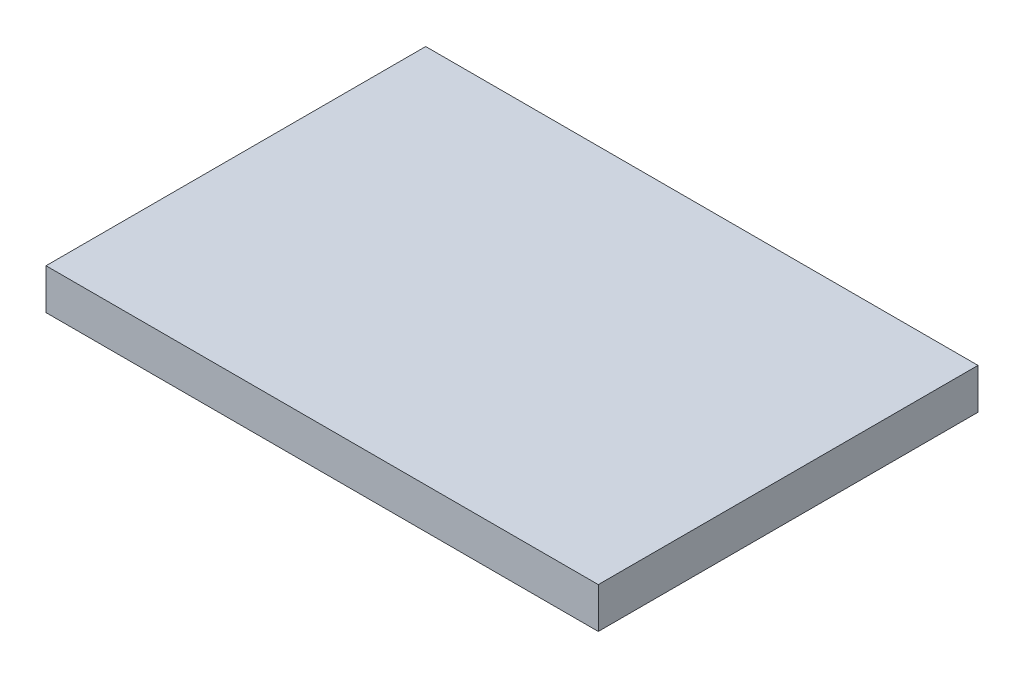
ISO-10303-21;
HEADER;
FILE_DESCRIPTION(('STEP AP214'),'2;1');
FILE_NAME('part.step','',(''),(''),'','','');
FILE_SCHEMA(('AUTOMOTIVE_DESIGN { 1 0 10303 214 1 1 1 1 }'));
ENDSEC;
DATA;
#1=APPLICATION_CONTEXT('core data for automotive mechanical design processes');
#2=APPLICATION_PROTOCOL_DEFINITION('international standard','automotive_design',2000,#1);
#3=PRODUCT_CONTEXT('',#1,'mechanical');
#4=PRODUCT('Part','Part','',(#3));
#5=PRODUCT_RELATED_PRODUCT_CATEGORY('part','',(#4));
#6=PRODUCT_DEFINITION_FORMATION('','',#4);
#7=PRODUCT_DEFINITION_CONTEXT('part definition',#1,'design');
#8=PRODUCT_DEFINITION('design','',#6,#7);
#9=PRODUCT_DEFINITION_SHAPE('','',#8);
#10=(LENGTH_UNIT() NAMED_UNIT(*) SI_UNIT(.MILLI.,.METRE.));
#11=(NAMED_UNIT(*) PLANE_ANGLE_UNIT() SI_UNIT($,.RADIAN.));
#12=(NAMED_UNIT(*) SI_UNIT($,.STERADIAN.) SOLID_ANGLE_UNIT());
#13=UNCERTAINTY_MEASURE_WITH_UNIT(LENGTH_MEASURE(1.E-05),#10,'distance_accuracy_value','');
#14=(GEOMETRIC_REPRESENTATION_CONTEXT(3) GLOBAL_UNCERTAINTY_ASSIGNED_CONTEXT((#13)) GLOBAL_UNIT_ASSIGNED_CONTEXT((#10,
#11,#12)) REPRESENTATION_CONTEXT('',''));
#15=CARTESIAN_POINT('',(0.,0.,0.));
#16=DIRECTION('',(0.,0.,1.));
#17=DIRECTION('',(1.,0.,0.));
#18=AXIS2_PLACEMENT_3D('',#15,#16,#17);
#19=CARTESIAN_POINT('',(-136.,20.,-93.5));
#20=DIRECTION('',(1.,0.,0.));
#21=DIRECTION('',(0.,0.,-1.));
#22=AXIS2_PLACEMENT_3D('',#19,#20,#21);
#23=PLANE('',#22);
#24=DIRECTION('',(0.,0.,1.));
#25=VECTOR('',#24,1.);
#26=CARTESIAN_POINT('',(-136.,0.,-93.5));
#27=LINE('',#26,#25);
#28=CARTESIAN_POINT('',(-136.,0.,-93.5));
#29=VERTEX_POINT('',#28);
#30=CARTESIAN_POINT('',(-136.,0.,93.5));
#31=VERTEX_POINT('',#30);
#32=EDGE_CURVE('E102',#29,#31,#27,.T.);
#33=ORIENTED_EDGE('',*,*,#32,.T.);
#34=DIRECTION('',(0.,-1.,0.));
#35=VECTOR('',#34,1.);
#36=CARTESIAN_POINT('',(-136.,20.,93.5));
#37=LINE('',#36,#35);
#38=CARTESIAN_POINT('',(-136.,20.,93.5));
#39=VERTEX_POINT('',#38);
#40=EDGE_CURVE('E11',#39,#31,#37,.T.);
#41=ORIENTED_EDGE('',*,*,#40,.F.);
#42=DIRECTION('',(0.,0.,1.));
#43=VECTOR('',#42,1.);
#44=CARTESIAN_POINT('',(-136.,20.,-93.5));
#45=LINE('',#44,#43);
#46=CARTESIAN_POINT('',(-136.,20.,-93.5));
#47=VERTEX_POINT('',#46);
#48=EDGE_CURVE('E90',#47,#39,#45,.T.);
#49=ORIENTED_EDGE('',*,*,#48,.F.);
#50=DIRECTION('',(0.,-1.,0.));
#51=VECTOR('',#50,1.);
#52=CARTESIAN_POINT('',(-136.,20.,-93.5));
#53=LINE('',#52,#51);
#54=EDGE_CURVE('E98',#47,#29,#53,.T.);
#55=ORIENTED_EDGE('',*,*,#54,.T.);
#56=EDGE_LOOP('',(#33,#41,#49,#55));
#57=FACE_BOUND('',#56,.T.);
#58=ADVANCED_FACE('F39',(#57),#23,.F.);
#59=CARTESIAN_POINT('',(-136.,20.,93.5));
#60=DIRECTION('',(0.,0.,-1.));
#61=DIRECTION('',(-1.,0.,0.));
#62=AXIS2_PLACEMENT_3D('',#59,#60,#61);
#63=PLANE('',#62);
#64=DIRECTION('',(1.,0.,0.));
#65=VECTOR('',#64,1.);
#66=CARTESIAN_POINT('',(-136.,0.,93.5));
#67=LINE('',#66,#65);
#68=CARTESIAN_POINT('',(136.,0.,93.5));
#69=VERTEX_POINT('',#68);
#70=EDGE_CURVE('E94',#31,#69,#67,.T.);
#71=ORIENTED_EDGE('',*,*,#70,.T.);
#72=DIRECTION('',(0.,-1.,0.));
#73=VECTOR('',#72,1.);
#74=CARTESIAN_POINT('',(136.,20.,93.5));
#75=LINE('',#74,#73);
#76=CARTESIAN_POINT('',(136.,20.,93.5));
#77=VERTEX_POINT('',#76);
#78=EDGE_CURVE('E47',#77,#69,#75,.T.);
#79=ORIENTED_EDGE('',*,*,#78,.F.);
#80=DIRECTION('',(1.,0.,0.));
#81=VECTOR('',#80,1.);
#82=CARTESIAN_POINT('',(-136.,20.,93.5));
#83=LINE('',#82,#81);
#84=EDGE_CURVE('E85',#39,#77,#83,.T.);
#85=ORIENTED_EDGE('',*,*,#84,.F.);
#86=ORIENTED_EDGE('',*,*,#40,.T.);
#87=EDGE_LOOP('',(#71,#79,#85,#86));
#88=FACE_BOUND('',#87,.T.);
#89=ADVANCED_FACE('F93',(#88),#63,.F.);
#90=CARTESIAN_POINT('',(136.,20.,-93.5));
#91=DIRECTION('',(-1.,0.,0.));
#92=DIRECTION('',(0.,0.,1.));
#93=AXIS2_PLACEMENT_3D('',#90,#91,#92);
#94=PLANE('',#93);
#95=DIRECTION('',(0.,0.,-1.));
#96=VECTOR('',#95,1.);
#97=CARTESIAN_POINT('',(136.,0.,-93.5));
#98=LINE('',#97,#96);
#99=CARTESIAN_POINT('',(136.,0.,-93.5));
#100=VERTEX_POINT('',#99);
#101=EDGE_CURVE('E72',#69,#100,#98,.T.);
#102=ORIENTED_EDGE('',*,*,#101,.T.);
#103=DIRECTION('',(0.,-1.,0.));
#104=VECTOR('',#103,1.);
#105=CARTESIAN_POINT('',(136.,20.,-93.5));
#106=LINE('',#105,#104);
#107=CARTESIAN_POINT('',(136.,20.,-93.5));
#108=VERTEX_POINT('',#107);
#109=EDGE_CURVE('E95',#108,#100,#106,.T.);
#110=ORIENTED_EDGE('',*,*,#109,.F.);
#111=DIRECTION('',(0.,0.,-1.));
#112=VECTOR('',#111,1.);
#113=CARTESIAN_POINT('',(136.,20.,-93.5));
#114=LINE('',#113,#112);
#115=EDGE_CURVE('E88',#77,#108,#114,.T.);
#116=ORIENTED_EDGE('',*,*,#115,.F.);
#117=ORIENTED_EDGE('',*,*,#78,.T.);
#118=EDGE_LOOP('',(#102,#110,#116,#117));
#119=FACE_BOUND('',#118,.T.);
#120=ADVANCED_FACE('F96',(#119),#94,.F.);
#121=CARTESIAN_POINT('',(-136.,20.,-93.5));
#122=DIRECTION('',(0.,0.,1.));
#123=DIRECTION('',(1.,0.,0.));
#124=AXIS2_PLACEMENT_3D('',#121,#122,#123);
#125=PLANE('',#124);
#126=DIRECTION('',(-1.,0.,0.));
#127=VECTOR('',#126,1.);
#128=CARTESIAN_POINT('',(-136.,0.,-93.5));
#129=LINE('',#128,#127);
#130=EDGE_CURVE('E78',#100,#29,#129,.T.);
#131=ORIENTED_EDGE('',*,*,#130,.T.);
#132=ORIENTED_EDGE('',*,*,#54,.F.);
#133=DIRECTION('',(-1.,0.,0.));
#134=VECTOR('',#133,1.);
#135=CARTESIAN_POINT('',(-136.,20.,-93.5));
#136=LINE('',#135,#134);
#137=EDGE_CURVE('E55',#108,#47,#136,.T.);
#138=ORIENTED_EDGE('',*,*,#137,.F.);
#139=ORIENTED_EDGE('',*,*,#109,.T.);
#140=EDGE_LOOP('',(#131,#132,#138,#139));
#141=FACE_BOUND('',#140,.T.);
#142=ADVANCED_FACE('F109',(#141),#125,.F.);
#143=CARTESIAN_POINT('',(0.,20.,0.));
#144=DIRECTION('',(0.,1.,0.));
#145=DIRECTION('',(0.,0.,1.));
#146=AXIS2_PLACEMENT_3D('',#143,#144,#145);
#147=PLANE('',#146);
#148=ORIENTED_EDGE('',*,*,#48,.T.);
#149=ORIENTED_EDGE('',*,*,#84,.T.);
#150=ORIENTED_EDGE('',*,*,#115,.T.);
#151=ORIENTED_EDGE('',*,*,#137,.T.);
#152=EDGE_LOOP('',(#148,#149,#150,#151));
#153=FACE_BOUND('',#152,.T.);
#154=ADVANCED_FACE('F86',(#153),#147,.T.);
#155=CARTESIAN_POINT('',(0.,0.,0.));
#156=DIRECTION('',(0.,1.,0.));
#157=DIRECTION('',(0.,0.,1.));
#158=AXIS2_PLACEMENT_3D('',#155,#156,#157);
#159=PLANE('',#158);
#160=ORIENTED_EDGE('',*,*,#32,.F.);
#161=ORIENTED_EDGE('',*,*,#130,.F.);
#162=ORIENTED_EDGE('',*,*,#101,.F.);
#163=ORIENTED_EDGE('',*,*,#70,.F.);
#164=EDGE_LOOP('',(#160,#161,#162,#163));
#165=FACE_BOUND('',#164,.T.);
#166=ADVANCED_FACE('F112',(#165),#159,.F.);
#167=CLOSED_SHELL('',(#58,#89,#120,#142,#154,#166));
#168=MANIFOLD_SOLID_BREP('B2',#167);
#169=ADVANCED_BREP_SHAPE_REPRESENTATION('',(#18,#168),#14);
#170=SHAPE_DEFINITION_REPRESENTATION(#9,#169);
ENDSEC;
END-ISO-10303-21;
